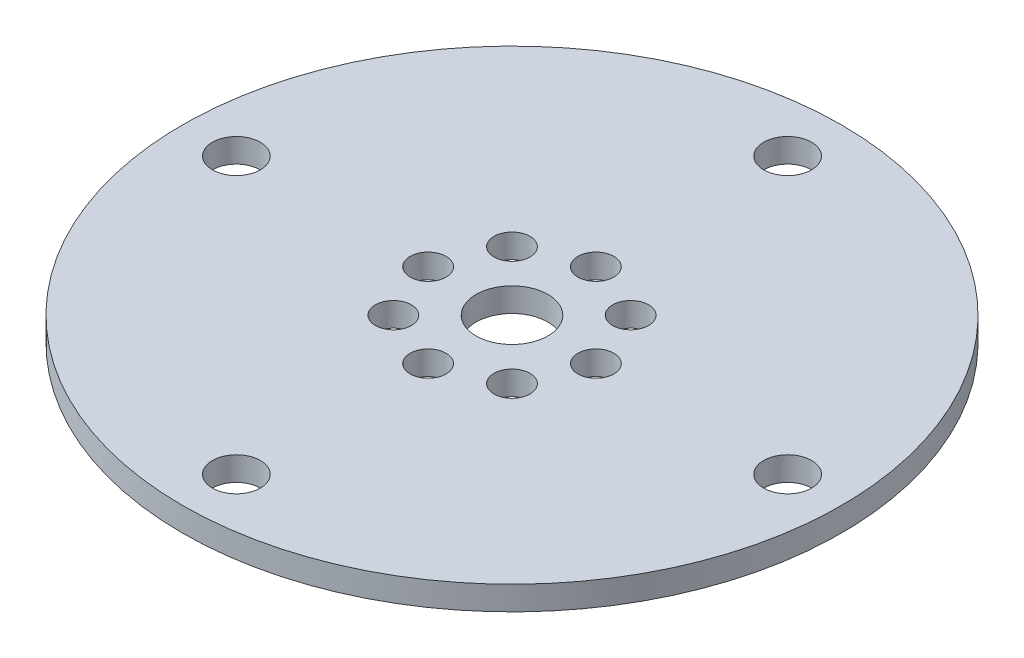
ISO-10303-21;
HEADER;
FILE_DESCRIPTION(('STEP AP214'),'2;1');
FILE_NAME('part.step','',(''),(''),'','','');
FILE_SCHEMA(('AUTOMOTIVE_DESIGN { 1 0 10303 214 1 1 1 1 }'));
ENDSEC;
DATA;
#1=APPLICATION_CONTEXT('core data for automotive mechanical design processes');
#2=APPLICATION_PROTOCOL_DEFINITION('international standard','automotive_design',2000,#1);
#3=PRODUCT_CONTEXT('',#1,'mechanical');
#4=PRODUCT('Part','Part','',(#3));
#5=PRODUCT_RELATED_PRODUCT_CATEGORY('part','',(#4));
#6=PRODUCT_DEFINITION_FORMATION('','',#4);
#7=PRODUCT_DEFINITION_CONTEXT('part definition',#1,'design');
#8=PRODUCT_DEFINITION('design','',#6,#7);
#9=PRODUCT_DEFINITION_SHAPE('','',#8);
#10=(LENGTH_UNIT() NAMED_UNIT(*) SI_UNIT(.MILLI.,.METRE.));
#11=(NAMED_UNIT(*) PLANE_ANGLE_UNIT() SI_UNIT($,.RADIAN.));
#12=(NAMED_UNIT(*) SI_UNIT($,.STERADIAN.) SOLID_ANGLE_UNIT());
#13=UNCERTAINTY_MEASURE_WITH_UNIT(LENGTH_MEASURE(1.E-05),#10,'distance_accuracy_value','');
#14=(GEOMETRIC_REPRESENTATION_CONTEXT(3) GLOBAL_UNCERTAINTY_ASSIGNED_CONTEXT((#13)) GLOBAL_UNIT_ASSIGNED_CONTEXT((#10,
#11,#12)) REPRESENTATION_CONTEXT('',''));
#15=CARTESIAN_POINT('',(0.,0.,0.));
#16=DIRECTION('',(0.,0.,1.));
#17=DIRECTION('',(1.,0.,0.));
#18=AXIS2_PLACEMENT_3D('',#15,#16,#17);
#19=CARTESIAN_POINT('',(0.,2.,0.));
#20=DIRECTION('',(0.,1.,0.));
#21=DIRECTION('',(0.,0.,1.));
#22=AXIS2_PLACEMENT_3D('',#19,#20,#21);
#23=PLANE('',#22);
#24=CARTESIAN_POINT('',(1.29894857088447E-12,2.,23.));
#25=DIRECTION('',(0.,1.,0.));
#26=DIRECTION('',(0.,0.,1.));
#27=AXIS2_PLACEMENT_3D('',#24,#25,#26);
#28=CIRCLE('',#27,2.);
#29=CARTESIAN_POINT('',(1.29894857088447E-12,2.,25.));
#30=VERTEX_POINT('',#29);
#31=EDGE_CURVE('E140',#30,#30,#28,.T.);
#32=ORIENTED_EDGE('',*,*,#31,.F.);
#33=EDGE_LOOP('',(#32));
#34=FACE_BOUND('',#33,.T.);
#35=CARTESIAN_POINT('',(0.,2.,-23.));
#36=DIRECTION('',(0.,1.,0.));
#37=DIRECTION('',(0.,0.,1.));
#38=AXIS2_PLACEMENT_3D('',#35,#36,#37);
#39=CIRCLE('',#38,2.);
#40=CARTESIAN_POINT('',(0.,2.,-21.));
#41=VERTEX_POINT('',#40);
#42=EDGE_CURVE('E124',#41,#41,#39,.T.);
#43=ORIENTED_EDGE('',*,*,#42,.F.);
#44=EDGE_LOOP('',(#43));
#45=FACE_BOUND('',#44,.T.);
#46=CARTESIAN_POINT('',(-6.99999999999951,2.,4.96951288652369E-13));
#47=DIRECTION('',(0.,1.,0.));
#48=DIRECTION('',(0.,0.,1.));
#49=AXIS2_PLACEMENT_3D('',#46,#47,#48);
#50=CIRCLE('',#49,1.50000000000069);
#51=CARTESIAN_POINT('',(-6.99999999999951,2.,1.50000000000119));
#52=VERTEX_POINT('',#51);
#53=EDGE_CURVE('E108',#52,#52,#50,.T.);
#54=ORIENTED_EDGE('',*,*,#53,.F.);
#55=EDGE_LOOP('',(#54));
#56=FACE_BOUND('',#55,.T.);
#57=CARTESIAN_POINT('',(9.92188071785931E-13,2.,7.));
#58=DIRECTION('',(0.,1.,0.));
#59=DIRECTION('',(0.,0.,1.));
#60=AXIS2_PLACEMENT_3D('',#57,#58,#59);
#61=CIRCLE('',#60,1.500000000001);
#62=CARTESIAN_POINT('',(9.92188071785931E-13,2.,8.500000000001));
#63=VERTEX_POINT('',#62);
#64=EDGE_CURVE('E92',#63,#63,#61,.T.);
#65=ORIENTED_EDGE('',*,*,#64,.F.);
#66=EDGE_LOOP('',(#65));
#67=FACE_BOUND('',#66,.T.);
#68=CARTESIAN_POINT('',(7.0000000000005,2.,-4.96094035892966E-13));
#69=DIRECTION('',(0.,1.,0.));
#70=DIRECTION('',(0.,0.,1.));
#71=AXIS2_PLACEMENT_3D('',#68,#69,#70);
#72=CIRCLE('',#71,1.50000000000035);
#73=CARTESIAN_POINT('',(7.0000000000005,2.,1.49999999999986));
#74=VERTEX_POINT('',#73);
#75=EDGE_CURVE('E76',#74,#74,#72,.T.);
#76=ORIENTED_EDGE('',*,*,#75,.F.);
#77=EDGE_LOOP('',(#76));
#78=FACE_BOUND('',#77,.T.);
#79=CARTESIAN_POINT('',(0.,2.,0.));
#80=DIRECTION('',(0.,1.,0.));
#81=DIRECTION('',(0.,0.,1.));
#82=AXIS2_PLACEMENT_3D('',#79,#80,#81);
#83=CIRCLE('',#82,3.);
#84=CARTESIAN_POINT('',(0.,2.,3.));
#85=VERTEX_POINT('',#84);
#86=EDGE_CURVE('E60',#85,#85,#83,.T.);
#87=ORIENTED_EDGE('',*,*,#86,.F.);
#88=EDGE_LOOP('',(#87));
#89=FACE_BOUND('',#88,.T.);
#90=CARTESIAN_POINT('',(0.,2.,0.));
#91=DIRECTION('',(0.,1.,0.));
#92=DIRECTION('',(0.,0.,1.));
#93=AXIS2_PLACEMENT_3D('',#90,#91,#92);
#94=CIRCLE('',#93,27.5);
#95=CARTESIAN_POINT('',(0.,2.,27.5));
#96=VERTEX_POINT('',#95);
#97=EDGE_CURVE('E10',#96,#96,#94,.T.);
#98=ORIENTED_EDGE('',*,*,#97,.T.);
#99=EDGE_LOOP('',(#98));
#100=FACE_BOUND('',#99,.T.);
#101=CARTESIAN_POINT('',(0.,2.,-7.));
#102=DIRECTION('',(0.,1.,0.));
#103=DIRECTION('',(0.,0.,1.));
#104=AXIS2_PLACEMENT_3D('',#101,#102,#103);
#105=CIRCLE('',#104,1.5);
#106=CARTESIAN_POINT('',(0.,2.,-5.5));
#107=VERTEX_POINT('',#106);
#108=EDGE_CURVE('E54',#107,#107,#105,.T.);
#109=ORIENTED_EDGE('',*,*,#108,.F.);
#110=EDGE_LOOP('',(#109));
#111=FACE_BOUND('',#110,.T.);
#112=CARTESIAN_POINT('',(4.94974746830584,2.,-4.94974746830583));
#113=DIRECTION('',(0.,1.,0.));
#114=DIRECTION('',(0.,0.,1.));
#115=AXIS2_PLACEMENT_3D('',#112,#113,#114);
#116=CIRCLE('',#115,1.5);
#117=CARTESIAN_POINT('',(4.94974746830584,2.,-3.44974746830583));
#118=VERTEX_POINT('',#117);
#119=EDGE_CURVE('E68',#118,#118,#116,.T.);
#120=ORIENTED_EDGE('',*,*,#119,.F.);
#121=EDGE_LOOP('',(#120));
#122=FACE_BOUND('',#121,.T.);
#123=CARTESIAN_POINT('',(4.94974746830668,2.,4.94974746830548));
#124=DIRECTION('',(0.,1.,0.));
#125=DIRECTION('',(0.,0.,1.));
#126=AXIS2_PLACEMENT_3D('',#123,#124,#125);
#127=CIRCLE('',#126,1.50000000000074);
#128=CARTESIAN_POINT('',(4.94974746830668,2.,6.44974746830622));
#129=VERTEX_POINT('',#128);
#130=EDGE_CURVE('E84',#129,#129,#127,.T.);
#131=ORIENTED_EDGE('',*,*,#130,.F.);
#132=EDGE_LOOP('',(#131));
#133=FACE_BOUND('',#132,.T.);
#134=CARTESIAN_POINT('',(-4.94974746830499,2.,4.94974746830618));
#135=DIRECTION('',(0.,1.,0.));
#136=DIRECTION('',(0.,0.,1.));
#137=AXIS2_PLACEMENT_3D('',#134,#135,#136);
#138=CIRCLE('',#137,1.50000000000097);
#139=CARTESIAN_POINT('',(-4.94974746830499,2.,6.44974746830716));
#140=VERTEX_POINT('',#139);
#141=EDGE_CURVE('E100',#140,#140,#138,.T.);
#142=ORIENTED_EDGE('',*,*,#141,.F.);
#143=EDGE_LOOP('',(#142));
#144=FACE_BOUND('',#143,.T.);
#145=CARTESIAN_POINT('',(-4.94974746830577,2.,-4.94974746830589));
#146=DIRECTION('',(0.,1.,0.));
#147=DIRECTION('',(0.,0.,1.));
#148=AXIS2_PLACEMENT_3D('',#145,#146,#147);
#149=CIRCLE('',#148,1.5);
#150=CARTESIAN_POINT('',(-4.94974746830577,2.,-3.44974746830589));
#151=VERTEX_POINT('',#150);
#152=EDGE_CURVE('E116',#151,#151,#149,.T.);
#153=ORIENTED_EDGE('',*,*,#152,.F.);
#154=EDGE_LOOP('',(#153));
#155=FACE_BOUND('',#154,.T.);
#156=CARTESIAN_POINT('',(23.0000000000007,2.,-6.49474285442234E-13));
#157=DIRECTION('',(0.,1.,0.));
#158=DIRECTION('',(0.,0.,1.));
#159=AXIS2_PLACEMENT_3D('',#156,#157,#158);
#160=CIRCLE('',#159,2.);
#161=CARTESIAN_POINT('',(23.0000000000007,2.,1.99999999999935));
#162=VERTEX_POINT('',#161);
#163=EDGE_CURVE('E132',#162,#162,#160,.T.);
#164=ORIENTED_EDGE('',*,*,#163,.F.);
#165=EDGE_LOOP('',(#164));
#166=FACE_BOUND('',#165,.T.);
#167=CARTESIAN_POINT('',(-22.9999999999993,2.,6.52290973080273E-13));
#168=DIRECTION('',(0.,1.,0.));
#169=DIRECTION('',(0.,0.,1.));
#170=AXIS2_PLACEMENT_3D('',#167,#168,#169);
#171=CIRCLE('',#170,2.);
#172=CARTESIAN_POINT('',(-22.9999999999993,2.,2.00000000000065));
#173=VERTEX_POINT('',#172);
#174=EDGE_CURVE('E148',#173,#173,#171,.T.);
#175=ORIENTED_EDGE('',*,*,#174,.F.);
#176=EDGE_LOOP('',(#175));
#177=FACE_BOUND('',#176,.T.);
#178=ADVANCED_FACE('F41',(#34,#45,#56,#67,#78,#89,#100,#111,#122,#133,#144,#155,#166,#177),#23,.T.);
#179=CARTESIAN_POINT('',(0.,0.,0.));
#180=DIRECTION('',(0.,1.,0.));
#181=DIRECTION('',(0.,0.,1.));
#182=AXIS2_PLACEMENT_3D('',#179,#180,#181);
#183=PLANE('',#182);
#184=CARTESIAN_POINT('',(0.,0.,0.));
#185=DIRECTION('',(0.,1.,0.));
#186=DIRECTION('',(0.,0.,1.));
#187=AXIS2_PLACEMENT_3D('',#184,#185,#186);
#188=CIRCLE('',#187,27.5);
#189=CARTESIAN_POINT('',(0.,0.,27.5));
#190=VERTEX_POINT('',#189);
#191=EDGE_CURVE('E45',#190,#190,#188,.T.);
#192=ORIENTED_EDGE('',*,*,#191,.F.);
#193=EDGE_LOOP('',(#192));
#194=FACE_BOUND('',#193,.T.);
#195=CARTESIAN_POINT('',(0.,0.,-7.));
#196=DIRECTION('',(0.,1.,0.));
#197=DIRECTION('',(0.,0.,1.));
#198=AXIS2_PLACEMENT_3D('',#195,#196,#197);
#199=CIRCLE('',#198,1.5);
#200=CARTESIAN_POINT('',(0.,0.,-5.5));
#201=VERTEX_POINT('',#200);
#202=EDGE_CURVE('E56',#201,#201,#199,.T.);
#203=ORIENTED_EDGE('',*,*,#202,.T.);
#204=EDGE_LOOP('',(#203));
#205=FACE_BOUND('',#204,.T.);
#206=CARTESIAN_POINT('',(0.,0.,0.));
#207=DIRECTION('',(0.,1.,0.));
#208=DIRECTION('',(0.,0.,1.));
#209=AXIS2_PLACEMENT_3D('',#206,#207,#208);
#210=CIRCLE('',#209,3.);
#211=CARTESIAN_POINT('',(0.,0.,3.));
#212=VERTEX_POINT('',#211);
#213=EDGE_CURVE('E64',#212,#212,#210,.T.);
#214=ORIENTED_EDGE('',*,*,#213,.T.);
#215=EDGE_LOOP('',(#214));
#216=FACE_BOUND('',#215,.T.);
#217=CARTESIAN_POINT('',(4.94974746830584,0.,-4.94974746830583));
#218=DIRECTION('',(0.,1.,0.));
#219=DIRECTION('',(0.,0.,1.));
#220=AXIS2_PLACEMENT_3D('',#217,#218,#219);
#221=CIRCLE('',#220,1.5);
#222=CARTESIAN_POINT('',(4.94974746830584,0.,-3.44974746830583));
#223=VERTEX_POINT('',#222);
#224=EDGE_CURVE('E72',#223,#223,#221,.T.);
#225=ORIENTED_EDGE('',*,*,#224,.T.);
#226=EDGE_LOOP('',(#225));
#227=FACE_BOUND('',#226,.T.);
#228=CARTESIAN_POINT('',(7.0000000000005,0.,-4.96094035892966E-13));
#229=DIRECTION('',(0.,1.,0.));
#230=DIRECTION('',(0.,0.,1.));
#231=AXIS2_PLACEMENT_3D('',#228,#229,#230);
#232=CIRCLE('',#231,1.50000000000035);
#233=CARTESIAN_POINT('',(7.0000000000005,0.,1.49999999999986));
#234=VERTEX_POINT('',#233);
#235=EDGE_CURVE('E80',#234,#234,#232,.T.);
#236=ORIENTED_EDGE('',*,*,#235,.T.);
#237=EDGE_LOOP('',(#236));
#238=FACE_BOUND('',#237,.T.);
#239=CARTESIAN_POINT('',(4.94974746830668,0.,4.94974746830548));
#240=DIRECTION('',(0.,1.,0.));
#241=DIRECTION('',(0.,0.,1.));
#242=AXIS2_PLACEMENT_3D('',#239,#240,#241);
#243=CIRCLE('',#242,1.50000000000074);
#244=CARTESIAN_POINT('',(4.94974746830668,0.,6.44974746830622));
#245=VERTEX_POINT('',#244);
#246=EDGE_CURVE('E88',#245,#245,#243,.T.);
#247=ORIENTED_EDGE('',*,*,#246,.T.);
#248=EDGE_LOOP('',(#247));
#249=FACE_BOUND('',#248,.T.);
#250=CARTESIAN_POINT('',(9.92188071785931E-13,0.,7.));
#251=DIRECTION('',(0.,1.,0.));
#252=DIRECTION('',(0.,0.,1.));
#253=AXIS2_PLACEMENT_3D('',#250,#251,#252);
#254=CIRCLE('',#253,1.500000000001);
#255=CARTESIAN_POINT('',(9.92188071785931E-13,0.,8.500000000001));
#256=VERTEX_POINT('',#255);
#257=EDGE_CURVE('E96',#256,#256,#254,.T.);
#258=ORIENTED_EDGE('',*,*,#257,.T.);
#259=EDGE_LOOP('',(#258));
#260=FACE_BOUND('',#259,.T.);
#261=CARTESIAN_POINT('',(-4.94974746830499,0.,4.94974746830618));
#262=DIRECTION('',(0.,1.,0.));
#263=DIRECTION('',(0.,0.,1.));
#264=AXIS2_PLACEMENT_3D('',#261,#262,#263);
#265=CIRCLE('',#264,1.50000000000097);
#266=CARTESIAN_POINT('',(-4.94974746830499,0.,6.44974746830716));
#267=VERTEX_POINT('',#266);
#268=EDGE_CURVE('E104',#267,#267,#265,.T.);
#269=ORIENTED_EDGE('',*,*,#268,.T.);
#270=EDGE_LOOP('',(#269));
#271=FACE_BOUND('',#270,.T.);
#272=CARTESIAN_POINT('',(-6.99999999999951,0.,4.96951288652369E-13));
#273=DIRECTION('',(0.,1.,0.));
#274=DIRECTION('',(0.,0.,1.));
#275=AXIS2_PLACEMENT_3D('',#272,#273,#274);
#276=CIRCLE('',#275,1.50000000000069);
#277=CARTESIAN_POINT('',(-6.99999999999951,0.,1.50000000000119));
#278=VERTEX_POINT('',#277);
#279=EDGE_CURVE('E112',#278,#278,#276,.T.);
#280=ORIENTED_EDGE('',*,*,#279,.T.);
#281=EDGE_LOOP('',(#280));
#282=FACE_BOUND('',#281,.T.);
#283=CARTESIAN_POINT('',(-4.94974746830577,0.,-4.94974746830589));
#284=DIRECTION('',(0.,1.,0.));
#285=DIRECTION('',(0.,0.,1.));
#286=AXIS2_PLACEMENT_3D('',#283,#284,#285);
#287=CIRCLE('',#286,1.5);
#288=CARTESIAN_POINT('',(-4.94974746830577,0.,-3.44974746830589));
#289=VERTEX_POINT('',#288);
#290=EDGE_CURVE('E120',#289,#289,#287,.T.);
#291=ORIENTED_EDGE('',*,*,#290,.T.);
#292=EDGE_LOOP('',(#291));
#293=FACE_BOUND('',#292,.T.);
#294=CARTESIAN_POINT('',(0.,0.,-23.));
#295=DIRECTION('',(0.,1.,0.));
#296=DIRECTION('',(0.,0.,1.));
#297=AXIS2_PLACEMENT_3D('',#294,#295,#296);
#298=CIRCLE('',#297,2.);
#299=CARTESIAN_POINT('',(0.,0.,-21.));
#300=VERTEX_POINT('',#299);
#301=EDGE_CURVE('E128',#300,#300,#298,.T.);
#302=ORIENTED_EDGE('',*,*,#301,.T.);
#303=EDGE_LOOP('',(#302));
#304=FACE_BOUND('',#303,.T.);
#305=CARTESIAN_POINT('',(23.0000000000007,0.,-6.49474285442234E-13));
#306=DIRECTION('',(0.,1.,0.));
#307=DIRECTION('',(0.,0.,1.));
#308=AXIS2_PLACEMENT_3D('',#305,#306,#307);
#309=CIRCLE('',#308,2.);
#310=CARTESIAN_POINT('',(23.0000000000007,0.,1.99999999999935));
#311=VERTEX_POINT('',#310);
#312=EDGE_CURVE('E136',#311,#311,#309,.T.);
#313=ORIENTED_EDGE('',*,*,#312,.T.);
#314=EDGE_LOOP('',(#313));
#315=FACE_BOUND('',#314,.T.);
#316=CARTESIAN_POINT('',(1.29894857088447E-12,0.,23.));
#317=DIRECTION('',(0.,1.,0.));
#318=DIRECTION('',(0.,0.,1.));
#319=AXIS2_PLACEMENT_3D('',#316,#317,#318);
#320=CIRCLE('',#319,2.);
#321=CARTESIAN_POINT('',(1.29894857088447E-12,0.,25.));
#322=VERTEX_POINT('',#321);
#323=EDGE_CURVE('E144',#322,#322,#320,.T.);
#324=ORIENTED_EDGE('',*,*,#323,.T.);
#325=EDGE_LOOP('',(#324));
#326=FACE_BOUND('',#325,.T.);
#327=CARTESIAN_POINT('',(-22.9999999999993,0.,6.52290973080273E-13));
#328=DIRECTION('',(0.,1.,0.));
#329=DIRECTION('',(0.,0.,1.));
#330=AXIS2_PLACEMENT_3D('',#327,#328,#329);
#331=CIRCLE('',#330,2.);
#332=CARTESIAN_POINT('',(-22.9999999999993,0.,2.00000000000065));
#333=VERTEX_POINT('',#332);
#334=EDGE_CURVE('E152',#333,#333,#331,.T.);
#335=ORIENTED_EDGE('',*,*,#334,.T.);
#336=EDGE_LOOP('',(#335));
#337=FACE_BOUND('',#336,.T.);
#338=ADVANCED_FACE('F164',(#194,#205,#216,#227,#238,#249,#260,#271,#282,#293,#304,#315,#326,
#337),#183,.F.);
#339=CARTESIAN_POINT('',(0.,2.,0.));
#340=DIRECTION('',(0.,-1.,0.));
#341=DIRECTION('',(0.,0.,-1.));
#342=AXIS2_PLACEMENT_3D('',#339,#340,#341);
#343=CYLINDRICAL_SURFACE('',#342,27.5);
#344=ORIENTED_EDGE('',*,*,#97,.F.);
#345=EDGE_LOOP('',(#344));
#346=FACE_BOUND('',#345,.T.);
#347=ORIENTED_EDGE('',*,*,#191,.T.);
#348=EDGE_LOOP('',(#347));
#349=FACE_BOUND('',#348,.T.);
#350=ADVANCED_FACE('F43',(#346,#349),#343,.T.);
#351=CARTESIAN_POINT('',(0.,2.,-7.));
#352=DIRECTION('',(0.,-1.,0.));
#353=DIRECTION('',(0.,0.,-1.));
#354=AXIS2_PLACEMENT_3D('',#351,#352,#353);
#355=CYLINDRICAL_SURFACE('',#354,1.5);
#356=ORIENTED_EDGE('',*,*,#108,.T.);
#357=EDGE_LOOP('',(#356));
#358=FACE_BOUND('',#357,.T.);
#359=ORIENTED_EDGE('',*,*,#202,.F.);
#360=EDGE_LOOP('',(#359));
#361=FACE_BOUND('',#360,.T.);
#362=ADVANCED_FACE('F174',(#358,#361),#355,.F.);
#363=CARTESIAN_POINT('',(0.,2.,0.));
#364=DIRECTION('',(0.,-1.,0.));
#365=DIRECTION('',(0.,0.,-1.));
#366=AXIS2_PLACEMENT_3D('',#363,#364,#365);
#367=CYLINDRICAL_SURFACE('',#366,3.);
#368=ORIENTED_EDGE('',*,*,#86,.T.);
#369=EDGE_LOOP('',(#368));
#370=FACE_BOUND('',#369,.T.);
#371=ORIENTED_EDGE('',*,*,#213,.F.);
#372=EDGE_LOOP('',(#371));
#373=FACE_BOUND('',#372,.T.);
#374=ADVANCED_FACE('F177',(#370,#373),#367,.F.);
#375=CARTESIAN_POINT('',(4.94974746830584,2.,-4.94974746830583));
#376=DIRECTION('',(0.,-1.,0.));
#377=DIRECTION('',(0.,0.,-1.));
#378=AXIS2_PLACEMENT_3D('',#375,#376,#377);
#379=CYLINDRICAL_SURFACE('',#378,1.5);
#380=ORIENTED_EDGE('',*,*,#119,.T.);
#381=EDGE_LOOP('',(#380));
#382=FACE_BOUND('',#381,.T.);
#383=ORIENTED_EDGE('',*,*,#224,.F.);
#384=EDGE_LOOP('',(#383));
#385=FACE_BOUND('',#384,.T.);
#386=ADVANCED_FACE('F181',(#382,#385),#379,.F.);
#387=CARTESIAN_POINT('',(7.0000000000005,2.,-4.96094035892966E-13));
#388=DIRECTION('',(0.,-1.,0.));
#389=DIRECTION('',(0.,0.,-1.));
#390=AXIS2_PLACEMENT_3D('',#387,#388,#389);
#391=CYLINDRICAL_SURFACE('',#390,1.50000000000035);
#392=ORIENTED_EDGE('',*,*,#75,.T.);
#393=EDGE_LOOP('',(#392));
#394=FACE_BOUND('',#393,.T.);
#395=ORIENTED_EDGE('',*,*,#235,.F.);
#396=EDGE_LOOP('',(#395));
#397=FACE_BOUND('',#396,.T.);
#398=ADVANCED_FACE('F185',(#394,#397),#391,.F.);
#399=CARTESIAN_POINT('',(4.94974746830668,2.,4.94974746830548));
#400=DIRECTION('',(0.,-1.,0.));
#401=DIRECTION('',(0.,0.,-1.));
#402=AXIS2_PLACEMENT_3D('',#399,#400,#401);
#403=CYLINDRICAL_SURFACE('',#402,1.50000000000074);
#404=ORIENTED_EDGE('',*,*,#130,.T.);
#405=EDGE_LOOP('',(#404));
#406=FACE_BOUND('',#405,.T.);
#407=ORIENTED_EDGE('',*,*,#246,.F.);
#408=EDGE_LOOP('',(#407));
#409=FACE_BOUND('',#408,.T.);
#410=ADVANCED_FACE('F189',(#406,#409),#403,.F.);
#411=CARTESIAN_POINT('',(9.92188071785931E-13,2.,7.));
#412=DIRECTION('',(0.,-1.,0.));
#413=DIRECTION('',(0.,0.,-1.));
#414=AXIS2_PLACEMENT_3D('',#411,#412,#413);
#415=CYLINDRICAL_SURFACE('',#414,1.500000000001);
#416=ORIENTED_EDGE('',*,*,#64,.T.);
#417=EDGE_LOOP('',(#416));
#418=FACE_BOUND('',#417,.T.);
#419=ORIENTED_EDGE('',*,*,#257,.F.);
#420=EDGE_LOOP('',(#419));
#421=FACE_BOUND('',#420,.T.);
#422=ADVANCED_FACE('F193',(#418,#421),#415,.F.);
#423=CARTESIAN_POINT('',(-4.94974746830499,2.,4.94974746830618));
#424=DIRECTION('',(0.,-1.,0.));
#425=DIRECTION('',(0.,0.,-1.));
#426=AXIS2_PLACEMENT_3D('',#423,#424,#425);
#427=CYLINDRICAL_SURFACE('',#426,1.50000000000097);
#428=ORIENTED_EDGE('',*,*,#141,.T.);
#429=EDGE_LOOP('',(#428));
#430=FACE_BOUND('',#429,.T.);
#431=ORIENTED_EDGE('',*,*,#268,.F.);
#432=EDGE_LOOP('',(#431));
#433=FACE_BOUND('',#432,.T.);
#434=ADVANCED_FACE('F197',(#430,#433),#427,.F.);
#435=CARTESIAN_POINT('',(-6.99999999999951,2.,4.96951288652369E-13));
#436=DIRECTION('',(0.,-1.,0.));
#437=DIRECTION('',(0.,0.,-1.));
#438=AXIS2_PLACEMENT_3D('',#435,#436,#437);
#439=CYLINDRICAL_SURFACE('',#438,1.50000000000069);
#440=ORIENTED_EDGE('',*,*,#53,.T.);
#441=EDGE_LOOP('',(#440));
#442=FACE_BOUND('',#441,.T.);
#443=ORIENTED_EDGE('',*,*,#279,.F.);
#444=EDGE_LOOP('',(#443));
#445=FACE_BOUND('',#444,.T.);
#446=ADVANCED_FACE('F201',(#442,#445),#439,.F.);
#447=CARTESIAN_POINT('',(-4.94974746830577,2.,-4.94974746830589));
#448=DIRECTION('',(0.,-1.,0.));
#449=DIRECTION('',(0.,0.,-1.));
#450=AXIS2_PLACEMENT_3D('',#447,#448,#449);
#451=CYLINDRICAL_SURFACE('',#450,1.5);
#452=ORIENTED_EDGE('',*,*,#152,.T.);
#453=EDGE_LOOP('',(#452));
#454=FACE_BOUND('',#453,.T.);
#455=ORIENTED_EDGE('',*,*,#290,.F.);
#456=EDGE_LOOP('',(#455));
#457=FACE_BOUND('',#456,.T.);
#458=ADVANCED_FACE('F205',(#454,#457),#451,.F.);
#459=CARTESIAN_POINT('',(0.,2.,-23.));
#460=DIRECTION('',(0.,-1.,0.));
#461=DIRECTION('',(0.,0.,-1.));
#462=AXIS2_PLACEMENT_3D('',#459,#460,#461);
#463=CYLINDRICAL_SURFACE('',#462,2.);
#464=ORIENTED_EDGE('',*,*,#42,.T.);
#465=EDGE_LOOP('',(#464));
#466=FACE_BOUND('',#465,.T.);
#467=ORIENTED_EDGE('',*,*,#301,.F.);
#468=EDGE_LOOP('',(#467));
#469=FACE_BOUND('',#468,.T.);
#470=ADVANCED_FACE('F209',(#466,#469),#463,.F.);
#471=CARTESIAN_POINT('',(23.0000000000007,2.,-6.49474285442234E-13));
#472=DIRECTION('',(0.,-1.,0.));
#473=DIRECTION('',(0.,0.,-1.));
#474=AXIS2_PLACEMENT_3D('',#471,#472,#473);
#475=CYLINDRICAL_SURFACE('',#474,2.);
#476=ORIENTED_EDGE('',*,*,#163,.T.);
#477=EDGE_LOOP('',(#476));
#478=FACE_BOUND('',#477,.T.);
#479=ORIENTED_EDGE('',*,*,#312,.F.);
#480=EDGE_LOOP('',(#479));
#481=FACE_BOUND('',#480,.T.);
#482=ADVANCED_FACE('F213',(#478,#481),#475,.F.);
#483=CARTESIAN_POINT('',(1.29894857088447E-12,2.,23.));
#484=DIRECTION('',(0.,-1.,0.));
#485=DIRECTION('',(0.,0.,-1.));
#486=AXIS2_PLACEMENT_3D('',#483,#484,#485);
#487=CYLINDRICAL_SURFACE('',#486,2.);
#488=ORIENTED_EDGE('',*,*,#31,.T.);
#489=EDGE_LOOP('',(#488));
#490=FACE_BOUND('',#489,.T.);
#491=ORIENTED_EDGE('',*,*,#323,.F.);
#492=EDGE_LOOP('',(#491));
#493=FACE_BOUND('',#492,.T.);
#494=ADVANCED_FACE('F217',(#490,#493),#487,.F.);
#495=CARTESIAN_POINT('',(-22.9999999999993,2.,6.52290973080273E-13));
#496=DIRECTION('',(0.,-1.,0.));
#497=DIRECTION('',(0.,0.,-1.));
#498=AXIS2_PLACEMENT_3D('',#495,#496,#497);
#499=CYLINDRICAL_SURFACE('',#498,2.);
#500=ORIENTED_EDGE('',*,*,#174,.T.);
#501=EDGE_LOOP('',(#500));
#502=FACE_BOUND('',#501,.T.);
#503=ORIENTED_EDGE('',*,*,#334,.F.);
#504=EDGE_LOOP('',(#503));
#505=FACE_BOUND('',#504,.T.);
#506=ADVANCED_FACE('F160',(#502,#505),#499,.F.);
#507=CLOSED_SHELL('',(#178,#338,#350,#362,#374,#386,#398,#410,#422,#434,#446,#458,#470,#482,
#494,#506));
#508=MANIFOLD_SOLID_BREP('B2',#507);
#509=ADVANCED_BREP_SHAPE_REPRESENTATION('',(#18,#508),#14);
#510=SHAPE_DEFINITION_REPRESENTATION(#9,#509);
ENDSEC;
END-ISO-10303-21;
